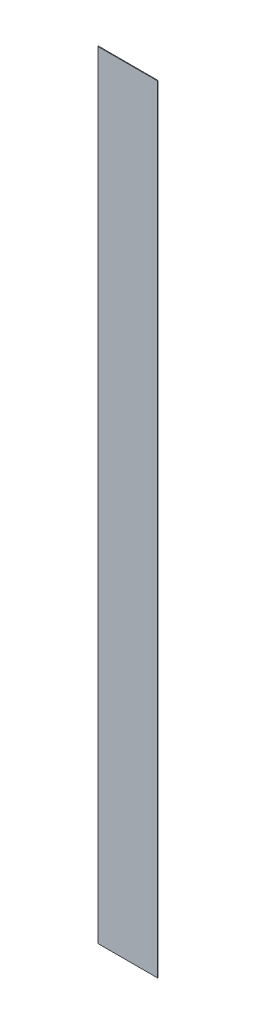
ISO-10303-21;
HEADER;
FILE_DESCRIPTION(('STEP AP214'),'2;1');
FILE_NAME('part.step','',(''),(''),'','','');
FILE_SCHEMA(('AUTOMOTIVE_DESIGN { 1 0 10303 214 1 1 1 1 }'));
ENDSEC;
DATA;
#1=APPLICATION_CONTEXT('core data for automotive mechanical design processes');
#2=APPLICATION_PROTOCOL_DEFINITION('international standard','automotive_design',2000,#1);
#3=PRODUCT_CONTEXT('',#1,'mechanical');
#4=PRODUCT('Part','Part','',(#3));
#5=PRODUCT_RELATED_PRODUCT_CATEGORY('part','',(#4));
#6=PRODUCT_DEFINITION_FORMATION('','',#4);
#7=PRODUCT_DEFINITION_CONTEXT('part definition',#1,'design');
#8=PRODUCT_DEFINITION('design','',#6,#7);
#9=PRODUCT_DEFINITION_SHAPE('','',#8);
#10=(LENGTH_UNIT() NAMED_UNIT(*) SI_UNIT(.MILLI.,.METRE.));
#11=(NAMED_UNIT(*) PLANE_ANGLE_UNIT() SI_UNIT($,.RADIAN.));
#12=(NAMED_UNIT(*) SI_UNIT($,.STERADIAN.) SOLID_ANGLE_UNIT());
#13=UNCERTAINTY_MEASURE_WITH_UNIT(LENGTH_MEASURE(1.E-05),#10,'distance_accuracy_value','');
#14=(GEOMETRIC_REPRESENTATION_CONTEXT(3) GLOBAL_UNCERTAINTY_ASSIGNED_CONTEXT((#13)) GLOBAL_UNIT_ASSIGNED_CONTEXT((#10,
#11,#12)) REPRESENTATION_CONTEXT('',''));
#15=CARTESIAN_POINT('',(0.,0.,0.));
#16=DIRECTION('',(0.,0.,1.));
#17=DIRECTION('',(1.,0.,0.));
#18=AXIS2_PLACEMENT_3D('',#15,#16,#17);
#19=CARTESIAN_POINT('',(243.,3154.,5.));
#20=DIRECTION('',(-1.,0.,0.));
#21=DIRECTION('',(0.,-1.,0.));
#22=AXIS2_PLACEMENT_3D('',#19,#20,#21);
#23=PLANE('',#22);
#24=DIRECTION('',(0.,1.,0.));
#25=VECTOR('',#24,1.);
#26=CARTESIAN_POINT('',(243.,3154.,0.));
#27=LINE('',#26,#25);
#28=CARTESIAN_POINT('',(243.,-3154.,0.));
#29=VERTEX_POINT('',#28);
#30=CARTESIAN_POINT('',(243.,3154.,0.));
#31=VERTEX_POINT('',#30);
#32=EDGE_CURVE('E98',#29,#31,#27,.T.);
#33=ORIENTED_EDGE('',*,*,#32,.T.);
#34=DIRECTION('',(0.,0.,-1.));
#35=VECTOR('',#34,1.);
#36=CARTESIAN_POINT('',(243.,3154.,5.));
#37=LINE('',#36,#35);
#38=CARTESIAN_POINT('',(243.,3154.,5.));
#39=VERTEX_POINT('',#38);
#40=EDGE_CURVE('E11',#39,#31,#37,.T.);
#41=ORIENTED_EDGE('',*,*,#40,.F.);
#42=DIRECTION('',(0.,1.,0.));
#43=VECTOR('',#42,1.);
#44=CARTESIAN_POINT('',(243.,3154.,5.));
#45=LINE('',#44,#43);
#46=CARTESIAN_POINT('',(243.,-3154.,5.));
#47=VERTEX_POINT('',#46);
#48=EDGE_CURVE('E86',#47,#39,#45,.T.);
#49=ORIENTED_EDGE('',*,*,#48,.F.);
#50=DIRECTION('',(0.,0.,-1.));
#51=VECTOR('',#50,1.);
#52=CARTESIAN_POINT('',(243.,-3154.,5.));
#53=LINE('',#52,#51);
#54=EDGE_CURVE('E94',#47,#29,#53,.T.);
#55=ORIENTED_EDGE('',*,*,#54,.T.);
#56=EDGE_LOOP('',(#33,#41,#49,#55));
#57=FACE_BOUND('',#56,.T.);
#58=ADVANCED_FACE('F35',(#57),#23,.F.);
#59=CARTESIAN_POINT('',(-243.,3154.,5.));
#60=DIRECTION('',(0.,-1.,0.));
#61=DIRECTION('',(0.,0.,-1.));
#62=AXIS2_PLACEMENT_3D('',#59,#60,#61);
#63=PLANE('',#62);
#64=DIRECTION('',(-1.,0.,0.));
#65=VECTOR('',#64,1.);
#66=CARTESIAN_POINT('',(-243.,3154.,0.));
#67=LINE('',#66,#65);
#68=CARTESIAN_POINT('',(-243.,3154.,0.));
#69=VERTEX_POINT('',#68);
#70=EDGE_CURVE('E90',#31,#69,#67,.T.);
#71=ORIENTED_EDGE('',*,*,#70,.T.);
#72=DIRECTION('',(0.,0.,-1.));
#73=VECTOR('',#72,1.);
#74=CARTESIAN_POINT('',(-243.,3154.,5.));
#75=LINE('',#74,#73);
#76=CARTESIAN_POINT('',(-243.,3154.,5.));
#77=VERTEX_POINT('',#76);
#78=EDGE_CURVE('E43',#77,#69,#75,.T.);
#79=ORIENTED_EDGE('',*,*,#78,.F.);
#80=DIRECTION('',(-1.,0.,0.));
#81=VECTOR('',#80,1.);
#82=CARTESIAN_POINT('',(-243.,3154.,5.));
#83=LINE('',#82,#81);
#84=EDGE_CURVE('E81',#39,#77,#83,.T.);
#85=ORIENTED_EDGE('',*,*,#84,.F.);
#86=ORIENTED_EDGE('',*,*,#40,.T.);
#87=EDGE_LOOP('',(#71,#79,#85,#86));
#88=FACE_BOUND('',#87,.T.);
#89=ADVANCED_FACE('F89',(#88),#63,.F.);
#90=CARTESIAN_POINT('',(-243.,3154.,5.));
#91=DIRECTION('',(1.,0.,0.));
#92=DIRECTION('',(0.,1.,0.));
#93=AXIS2_PLACEMENT_3D('',#90,#91,#92);
#94=PLANE('',#93);
#95=DIRECTION('',(0.,-1.,0.));
#96=VECTOR('',#95,1.);
#97=CARTESIAN_POINT('',(-243.,3154.,0.));
#98=LINE('',#97,#96);
#99=CARTESIAN_POINT('',(-243.,-3154.,0.));
#100=VERTEX_POINT('',#99);
#101=EDGE_CURVE('E68',#69,#100,#98,.T.);
#102=ORIENTED_EDGE('',*,*,#101,.T.);
#103=DIRECTION('',(0.,0.,-1.));
#104=VECTOR('',#103,1.);
#105=CARTESIAN_POINT('',(-243.,-3154.,5.));
#106=LINE('',#105,#104);
#107=CARTESIAN_POINT('',(-243.,-3154.,5.));
#108=VERTEX_POINT('',#107);
#109=EDGE_CURVE('E91',#108,#100,#106,.T.);
#110=ORIENTED_EDGE('',*,*,#109,.F.);
#111=DIRECTION('',(0.,-1.,0.));
#112=VECTOR('',#111,1.);
#113=CARTESIAN_POINT('',(-243.,3154.,5.));
#114=LINE('',#113,#112);
#115=EDGE_CURVE('E84',#77,#108,#114,.T.);
#116=ORIENTED_EDGE('',*,*,#115,.F.);
#117=ORIENTED_EDGE('',*,*,#78,.T.);
#118=EDGE_LOOP('',(#102,#110,#116,#117));
#119=FACE_BOUND('',#118,.T.);
#120=ADVANCED_FACE('F92',(#119),#94,.F.);
#121=CARTESIAN_POINT('',(-243.,-3154.,5.));
#122=DIRECTION('',(0.,1.,0.));
#123=DIRECTION('',(0.,0.,1.));
#124=AXIS2_PLACEMENT_3D('',#121,#122,#123);
#125=PLANE('',#124);
#126=DIRECTION('',(1.,0.,0.));
#127=VECTOR('',#126,1.);
#128=CARTESIAN_POINT('',(-243.,-3154.,0.));
#129=LINE('',#128,#127);
#130=EDGE_CURVE('E74',#100,#29,#129,.T.);
#131=ORIENTED_EDGE('',*,*,#130,.T.);
#132=ORIENTED_EDGE('',*,*,#54,.F.);
#133=DIRECTION('',(1.,0.,0.));
#134=VECTOR('',#133,1.);
#135=CARTESIAN_POINT('',(-243.,-3154.,5.));
#136=LINE('',#135,#134);
#137=EDGE_CURVE('E51',#108,#47,#136,.T.);
#138=ORIENTED_EDGE('',*,*,#137,.F.);
#139=ORIENTED_EDGE('',*,*,#109,.T.);
#140=EDGE_LOOP('',(#131,#132,#138,#139));
#141=FACE_BOUND('',#140,.T.);
#142=ADVANCED_FACE('F105',(#141),#125,.F.);
#143=CARTESIAN_POINT('',(243.,-3154.,5.));
#144=DIRECTION('',(0.,0.,1.));
#145=DIRECTION('',(1.,0.,0.));
#146=AXIS2_PLACEMENT_3D('',#143,#144,#145);
#147=PLANE('',#146);
#148=ORIENTED_EDGE('',*,*,#48,.T.);
#149=ORIENTED_EDGE('',*,*,#84,.T.);
#150=ORIENTED_EDGE('',*,*,#115,.T.);
#151=ORIENTED_EDGE('',*,*,#137,.T.);
#152=EDGE_LOOP('',(#148,#149,#150,#151));
#153=FACE_BOUND('',#152,.T.);
#154=ADVANCED_FACE('F82',(#153),#147,.T.);
#155=CARTESIAN_POINT('',(243.,-3154.,0.));
#156=DIRECTION('',(0.,0.,1.));
#157=DIRECTION('',(1.,0.,0.));
#158=AXIS2_PLACEMENT_3D('',#155,#156,#157);
#159=PLANE('',#158);
#160=ORIENTED_EDGE('',*,*,#32,.F.);
#161=ORIENTED_EDGE('',*,*,#130,.F.);
#162=ORIENTED_EDGE('',*,*,#101,.F.);
#163=ORIENTED_EDGE('',*,*,#70,.F.);
#164=EDGE_LOOP('',(#160,#161,#162,#163));
#165=FACE_BOUND('',#164,.T.);
#166=ADVANCED_FACE('F108',(#165),#159,.F.);
#167=CLOSED_SHELL('',(#58,#89,#120,#142,#154,#166));
#168=MANIFOLD_SOLID_BREP('B2',#167);
#169=ADVANCED_BREP_SHAPE_REPRESENTATION('',(#18,#168),#14);
#170=SHAPE_DEFINITION_REPRESENTATION(#9,#169);
ENDSEC;
END-ISO-10303-21;
